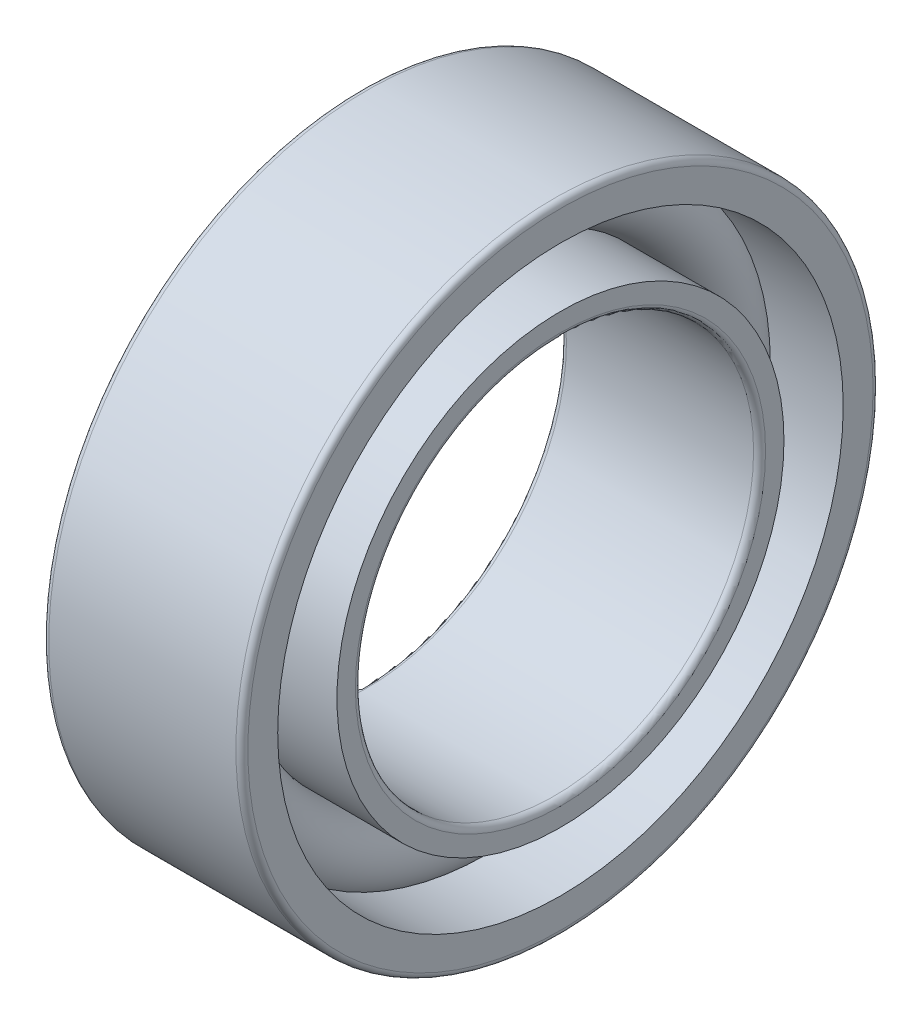
ISO-10303-21;
HEADER;
FILE_DESCRIPTION(('STEP AP214'),'2;1');
FILE_NAME('part.step','',(''),(''),'','','');
FILE_SCHEMA(('AUTOMOTIVE_DESIGN { 1 0 10303 214 1 1 1 1 }'));
ENDSEC;
DATA;
#1=APPLICATION_CONTEXT('core data for automotive mechanical design processes');
#2=APPLICATION_PROTOCOL_DEFINITION('international standard','automotive_design',2000,#1);
#3=PRODUCT_CONTEXT('',#1,'mechanical');
#4=PRODUCT('Part','Part','',(#3));
#5=PRODUCT_RELATED_PRODUCT_CATEGORY('part','',(#4));
#6=PRODUCT_DEFINITION_FORMATION('','',#4);
#7=PRODUCT_DEFINITION_CONTEXT('part definition',#1,'design');
#8=PRODUCT_DEFINITION('design','',#6,#7);
#9=PRODUCT_DEFINITION_SHAPE('','',#8);
#10=(LENGTH_UNIT() NAMED_UNIT(*) SI_UNIT(.MILLI.,.METRE.));
#11=(NAMED_UNIT(*) PLANE_ANGLE_UNIT() SI_UNIT($,.RADIAN.));
#12=(NAMED_UNIT(*) SI_UNIT($,.STERADIAN.) SOLID_ANGLE_UNIT());
#13=UNCERTAINTY_MEASURE_WITH_UNIT(LENGTH_MEASURE(1.E-05),#10,'distance_accuracy_value','');
#14=(GEOMETRIC_REPRESENTATION_CONTEXT(3) GLOBAL_UNCERTAINTY_ASSIGNED_CONTEXT((#13)) GLOBAL_UNIT_ASSIGNED_CONTEXT((#10,
#11,#12)) REPRESENTATION_CONTEXT('',''));
#15=CARTESIAN_POINT('',(0.,0.,0.));
#16=DIRECTION('',(0.,0.,1.));
#17=DIRECTION('',(1.,0.,0.));
#18=AXIS2_PLACEMENT_3D('',#15,#16,#17);
#19=CARTESIAN_POINT('',(0.,0.,0.));
#20=DIRECTION('',(-1.,0.,0.));
#21=DIRECTION('',(0.,0.,1.));
#22=AXIS2_PLACEMENT_3D('',#19,#20,#21);
#23=TOROIDAL_SURFACE('',#22,13.,1.8);
#24=CARTESIAN_POINT('',(1.34164078649988,0.,0.));
#25=DIRECTION('',(-1.,0.,0.));
#26=DIRECTION('',(0.,0.,1.));
#27=AXIS2_PLACEMENT_3D('',#24,#25,#26);
#28=CIRCLE('',#27,14.2);
#29=CARTESIAN_POINT('',(1.34164078649988,0.,14.2));
#30=VERTEX_POINT('',#29);
#31=EDGE_CURVE('E36',#30,#30,#28,.F.);
#32=ORIENTED_EDGE('',*,*,#31,.T.);
#33=EDGE_LOOP('',(#32));
#34=FACE_BOUND('',#33,.T.);
#35=CARTESIAN_POINT('',(0.29895651857753,0.,0.));
#36=DIRECTION('',(-1.,0.,0.));
#37=DIRECTION('',(0.,0.,1.));
#38=AXIS2_PLACEMENT_3D('',#35,#36,#37);
#39=CIRCLE('',#38,11.225);
#40=CARTESIAN_POINT('',(0.29895651857753,0.,11.225));
#41=VERTEX_POINT('',#40);
#42=EDGE_CURVE('E10',#41,#41,#39,.T.);
#43=ORIENTED_EDGE('',*,*,#42,.T.);
#44=EDGE_LOOP('',(#43));
#45=FACE_BOUND('',#44,.T.);
#46=ADVANCED_FACE('F32',(#34,#45),#23,.T.);
#47=CARTESIAN_POINT('',(-20.6375,0.,0.));
#48=DIRECTION('',(1.,0.,0.));
#49=DIRECTION('',(0.,0.,-1.));
#50=AXIS2_PLACEMENT_3D('',#47,#48,#49);
#51=CYLINDRICAL_SURFACE('',#50,11.225);
#52=CARTESIAN_POINT('',(5.,0.,0.));
#53=DIRECTION('',(1.,0.,0.));
#54=DIRECTION('',(0.,0.,-1.));
#55=AXIS2_PLACEMENT_3D('',#52,#53,#54);
#56=CIRCLE('',#55,11.225);
#57=CARTESIAN_POINT('',(5.,0.,-11.225));
#58=VERTEX_POINT('',#57);
#59=EDGE_CURVE('E45',#58,#58,#56,.T.);
#60=ORIENTED_EDGE('',*,*,#59,.F.);
#61=EDGE_LOOP('',(#60));
#62=FACE_BOUND('',#61,.T.);
#63=ORIENTED_EDGE('',*,*,#42,.F.);
#64=EDGE_LOOP('',(#63));
#65=FACE_BOUND('',#64,.T.);
#66=ADVANCED_FACE('F84',(#62,#65),#51,.T.);
#67=CARTESIAN_POINT('',(-20.6375,0.,0.));
#68=DIRECTION('',(1.,0.,0.));
#69=DIRECTION('',(0.,0.,-1.));
#70=AXIS2_PLACEMENT_3D('',#67,#68,#69);
#71=CYLINDRICAL_SURFACE('',#70,11.8);
#72=CARTESIAN_POINT('',(-5.,0.,0.));
#73=DIRECTION('',(1.,0.,0.));
#74=DIRECTION('',(0.,0.,-1.));
#75=AXIS2_PLACEMENT_3D('',#72,#73,#74);
#76=CIRCLE('',#75,11.8);
#77=CARTESIAN_POINT('',(-5.,0.,-11.8));
#78=VERTEX_POINT('',#77);
#79=EDGE_CURVE('E54',#78,#78,#76,.T.);
#80=ORIENTED_EDGE('',*,*,#79,.T.);
#81=EDGE_LOOP('',(#80));
#82=FACE_BOUND('',#81,.T.);
#83=CARTESIAN_POINT('',(-1.34164078649988,0.,0.));
#84=DIRECTION('',(1.,0.,0.));
#85=DIRECTION('',(0.,0.,-1.));
#86=AXIS2_PLACEMENT_3D('',#83,#84,#85);
#87=CIRCLE('',#86,11.8);
#88=CARTESIAN_POINT('',(-1.34164078649988,0.,-11.8));
#89=VERTEX_POINT('',#88);
#90=EDGE_CURVE('E40',#89,#89,#87,.T.);
#91=ORIENTED_EDGE('',*,*,#90,.F.);
#92=EDGE_LOOP('',(#91));
#93=FACE_BOUND('',#92,.T.);
#94=ADVANCED_FACE('F87',(#82,#93),#71,.T.);
#95=CARTESIAN_POINT('',(5.,10.3,0.));
#96=DIRECTION('',(1.,0.,0.));
#97=DIRECTION('',(0.,0.,-1.));
#98=AXIS2_PLACEMENT_3D('',#95,#96,#97);
#99=PLANE('',#98);
#100=ORIENTED_EDGE('',*,*,#59,.T.);
#101=EDGE_LOOP('',(#100));
#102=FACE_BOUND('',#101,.T.);
#103=CARTESIAN_POINT('',(5.,0.,0.));
#104=DIRECTION('',(1.,0.,0.));
#105=DIRECTION('',(0.,0.,-1.));
#106=AXIS2_PLACEMENT_3D('',#103,#104,#105);
#107=CIRCLE('',#106,10.3);
#108=CARTESIAN_POINT('',(5.,0.,-10.3));
#109=VERTEX_POINT('',#108);
#110=EDGE_CURVE('E76',#109,#109,#107,.T.);
#111=ORIENTED_EDGE('',*,*,#110,.F.);
#112=EDGE_LOOP('',(#111));
#113=FACE_BOUND('',#112,.T.);
#114=ADVANCED_FACE('F81',(#102,#113),#99,.T.);
#115=CARTESIAN_POINT('',(4.7,0.,0.));
#116=DIRECTION('',(1.,0.,0.));
#117=DIRECTION('',(0.,0.,-1.));
#118=AXIS2_PLACEMENT_3D('',#115,#116,#117);
#119=TOROIDAL_SURFACE('',#118,10.3,0.299999999999998);
#120=ORIENTED_EDGE('',*,*,#110,.T.);
#121=EDGE_LOOP('',(#120));
#122=FACE_BOUND('',#121,.T.);
#123=CARTESIAN_POINT('',(4.7,0.,0.));
#124=DIRECTION('',(1.,0.,0.));
#125=DIRECTION('',(0.,0.,-1.));
#126=AXIS2_PLACEMENT_3D('',#123,#124,#125);
#127=CIRCLE('',#126,10.);
#128=CARTESIAN_POINT('',(4.7,0.,-10.));
#129=VERTEX_POINT('',#128);
#130=EDGE_CURVE('E73',#129,#129,#127,.T.);
#131=ORIENTED_EDGE('',*,*,#130,.F.);
#132=EDGE_LOOP('',(#131));
#133=FACE_BOUND('',#132,.T.);
#134=ADVANCED_FACE('F98',(#122,#133),#119,.T.);
#135=CARTESIAN_POINT('',(-20.6375,0.,0.));
#136=DIRECTION('',(1.,0.,0.));
#137=DIRECTION('',(0.,0.,-1.));
#138=AXIS2_PLACEMENT_3D('',#135,#136,#137);
#139=CYLINDRICAL_SURFACE('',#138,10.);
#140=ORIENTED_EDGE('',*,*,#130,.T.);
#141=EDGE_LOOP('',(#140));
#142=FACE_BOUND('',#141,.T.);
#143=CARTESIAN_POINT('',(-4.7,0.,0.));
#144=DIRECTION('',(1.,0.,0.));
#145=DIRECTION('',(0.,0.,-1.));
#146=AXIS2_PLACEMENT_3D('',#143,#144,#145);
#147=CIRCLE('',#146,10.);
#148=CARTESIAN_POINT('',(-4.7,0.,-10.));
#149=VERTEX_POINT('',#148);
#150=EDGE_CURVE('E70',#149,#149,#147,.T.);
#151=ORIENTED_EDGE('',*,*,#150,.F.);
#152=EDGE_LOOP('',(#151));
#153=FACE_BOUND('',#152,.T.);
#154=ADVANCED_FACE('F101',(#142,#153),#139,.F.);
#155=CARTESIAN_POINT('',(-4.7,0.,0.));
#156=DIRECTION('',(1.,0.,0.));
#157=DIRECTION('',(0.,0.,-1.));
#158=AXIS2_PLACEMENT_3D('',#155,#156,#157);
#159=TOROIDAL_SURFACE('',#158,10.3,0.299999999999998);
#160=ORIENTED_EDGE('',*,*,#150,.T.);
#161=EDGE_LOOP('',(#160));
#162=FACE_BOUND('',#161,.T.);
#163=CARTESIAN_POINT('',(-5.,0.,0.));
#164=DIRECTION('',(1.,0.,0.));
#165=DIRECTION('',(0.,0.,-1.));
#166=AXIS2_PLACEMENT_3D('',#163,#164,#165);
#167=CIRCLE('',#166,10.3);
#168=CARTESIAN_POINT('',(-5.,0.,-10.3));
#169=VERTEX_POINT('',#168);
#170=EDGE_CURVE('E67',#169,#169,#167,.T.);
#171=ORIENTED_EDGE('',*,*,#170,.F.);
#172=EDGE_LOOP('',(#171));
#173=FACE_BOUND('',#172,.T.);
#174=ADVANCED_FACE('F105',(#162,#173),#159,.T.);
#175=CARTESIAN_POINT('',(-5.,11.8,0.));
#176=DIRECTION('',(-1.,0.,0.));
#177=DIRECTION('',(0.,0.,1.));
#178=AXIS2_PLACEMENT_3D('',#175,#176,#177);
#179=PLANE('',#178);
#180=ORIENTED_EDGE('',*,*,#170,.T.);
#181=EDGE_LOOP('',(#180));
#182=FACE_BOUND('',#181,.T.);
#183=ORIENTED_EDGE('',*,*,#79,.F.);
#184=EDGE_LOOP('',(#183));
#185=FACE_BOUND('',#184,.T.);
#186=ADVANCED_FACE('F109',(#182,#185),#179,.T.);
#187=CARTESIAN_POINT('',(-0.29895651857753,0.,0.));
#188=DIRECTION('',(1.,0.,0.));
#189=DIRECTION('',(0.,0.,-1.));
#190=AXIS2_PLACEMENT_3D('',#187,#188,#189);
#191=CIRCLE('',#190,14.775);
#192=CARTESIAN_POINT('',(-0.29895651857753,0.,-14.775));
#193=VERTEX_POINT('',#192);
#194=EDGE_CURVE('E48',#193,#193,#191,.F.);
#195=ORIENTED_EDGE('',*,*,#194,.T.);
#196=EDGE_LOOP('',(#195));
#197=FACE_BOUND('',#196,.T.);
#198=ORIENTED_EDGE('',*,*,#90,.T.);
#199=EDGE_LOOP('',(#198));
#200=FACE_BOUND('',#199,.T.);
#201=ADVANCED_FACE('F34',(#197,#200),#23,.T.);
#202=CARTESIAN_POINT('',(-20.6375,0.,0.));
#203=DIRECTION('',(1.,0.,0.));
#204=DIRECTION('',(0.,0.,-1.));
#205=AXIS2_PLACEMENT_3D('',#202,#203,#204);
#206=CYLINDRICAL_SURFACE('',#205,14.2);
#207=CARTESIAN_POINT('',(5.,0.,0.));
#208=DIRECTION('',(1.,0.,0.));
#209=DIRECTION('',(0.,0.,-1.));
#210=AXIS2_PLACEMENT_3D('',#207,#208,#209);
#211=CIRCLE('',#210,14.2);
#212=CARTESIAN_POINT('',(5.,0.,-14.2));
#213=VERTEX_POINT('',#212);
#214=EDGE_CURVE('E150',#213,#213,#211,.T.);
#215=ORIENTED_EDGE('',*,*,#214,.T.);
#216=EDGE_LOOP('',(#215));
#217=FACE_BOUND('',#216,.T.);
#218=ORIENTED_EDGE('',*,*,#31,.F.);
#219=EDGE_LOOP('',(#218));
#220=FACE_BOUND('',#219,.T.);
#221=ADVANCED_FACE('F131',(#217,#220),#206,.F.);
#222=CARTESIAN_POINT('',(-20.6375,0.,0.));
#223=DIRECTION('',(1.,0.,0.));
#224=DIRECTION('',(0.,0.,-1.));
#225=AXIS2_PLACEMENT_3D('',#222,#223,#224);
#226=CYLINDRICAL_SURFACE('',#225,14.775);
#227=CARTESIAN_POINT('',(-5.,0.,0.));
#228=DIRECTION('',(1.,0.,0.));
#229=DIRECTION('',(0.,0.,-1.));
#230=AXIS2_PLACEMENT_3D('',#227,#228,#229);
#231=CIRCLE('',#230,14.775);
#232=CARTESIAN_POINT('',(-5.,0.,-14.775));
#233=VERTEX_POINT('',#232);
#234=EDGE_CURVE('E145',#233,#233,#231,.T.);
#235=ORIENTED_EDGE('',*,*,#234,.F.);
#236=EDGE_LOOP('',(#235));
#237=FACE_BOUND('',#236,.T.);
#238=ORIENTED_EDGE('',*,*,#194,.F.);
#239=EDGE_LOOP('',(#238));
#240=FACE_BOUND('',#239,.T.);
#241=ADVANCED_FACE('F118',(#237,#240),#226,.F.);
#242=CARTESIAN_POINT('',(-4.7,0.,0.));
#243=DIRECTION('',(1.,0.,0.));
#244=DIRECTION('',(0.,0.,-1.));
#245=AXIS2_PLACEMENT_3D('',#242,#243,#244);
#246=TOROIDAL_SURFACE('',#245,15.7,0.300000000000001);
#247=CARTESIAN_POINT('',(-5.,0.,0.));
#248=DIRECTION('',(1.,0.,0.));
#249=DIRECTION('',(0.,0.,-1.));
#250=AXIS2_PLACEMENT_3D('',#247,#248,#249);
#251=CIRCLE('',#250,15.7);
#252=CARTESIAN_POINT('',(-5.,0.,-15.7));
#253=VERTEX_POINT('',#252);
#254=EDGE_CURVE('E148',#253,#253,#251,.T.);
#255=ORIENTED_EDGE('',*,*,#254,.T.);
#256=EDGE_LOOP('',(#255));
#257=FACE_BOUND('',#256,.T.);
#258=CARTESIAN_POINT('',(-4.7,0.,0.));
#259=DIRECTION('',(1.,0.,0.));
#260=DIRECTION('',(0.,0.,-1.));
#261=AXIS2_PLACEMENT_3D('',#258,#259,#260);
#262=CIRCLE('',#261,16.);
#263=CARTESIAN_POINT('',(-4.7,0.,-16.));
#264=VERTEX_POINT('',#263);
#265=EDGE_CURVE('E50',#264,#264,#262,.T.);
#266=ORIENTED_EDGE('',*,*,#265,.F.);
#267=EDGE_LOOP('',(#266));
#268=FACE_BOUND('',#267,.T.);
#269=ADVANCED_FACE('F114',(#257,#268),#246,.T.);
#270=CARTESIAN_POINT('',(-20.6375,0.,0.));
#271=DIRECTION('',(1.,0.,0.));
#272=DIRECTION('',(0.,0.,-1.));
#273=AXIS2_PLACEMENT_3D('',#270,#271,#272);
#274=CYLINDRICAL_SURFACE('',#273,16.);
#275=ORIENTED_EDGE('',*,*,#265,.T.);
#276=EDGE_LOOP('',(#275));
#277=FACE_BOUND('',#276,.T.);
#278=CARTESIAN_POINT('',(4.7,0.,0.));
#279=DIRECTION('',(1.,0.,0.));
#280=DIRECTION('',(0.,0.,-1.));
#281=AXIS2_PLACEMENT_3D('',#278,#279,#280);
#282=CIRCLE('',#281,16.);
#283=CARTESIAN_POINT('',(4.7,0.,-16.));
#284=VERTEX_POINT('',#283);
#285=EDGE_CURVE('E56',#284,#284,#282,.T.);
#286=ORIENTED_EDGE('',*,*,#285,.F.);
#287=EDGE_LOOP('',(#286));
#288=FACE_BOUND('',#287,.T.);
#289=ADVANCED_FACE('F117',(#277,#288),#274,.T.);
#290=CARTESIAN_POINT('',(4.7,0.,0.));
#291=DIRECTION('',(1.,0.,0.));
#292=DIRECTION('',(0.,0.,-1.));
#293=AXIS2_PLACEMENT_3D('',#290,#291,#292);
#294=TOROIDAL_SURFACE('',#293,15.7,0.300000000000001);
#295=ORIENTED_EDGE('',*,*,#285,.T.);
#296=EDGE_LOOP('',(#295));
#297=FACE_BOUND('',#296,.T.);
#298=CARTESIAN_POINT('',(5.,0.,0.));
#299=DIRECTION('',(1.,0.,0.));
#300=DIRECTION('',(0.,0.,-1.));
#301=AXIS2_PLACEMENT_3D('',#298,#299,#300);
#302=CIRCLE('',#301,15.7);
#303=CARTESIAN_POINT('',(5.,0.,-15.7));
#304=VERTEX_POINT('',#303);
#305=EDGE_CURVE('E61',#304,#304,#302,.T.);
#306=ORIENTED_EDGE('',*,*,#305,.F.);
#307=EDGE_LOOP('',(#306));
#308=FACE_BOUND('',#307,.T.);
#309=ADVANCED_FACE('F122',(#297,#308),#294,.T.);
#310=CARTESIAN_POINT('',(5.,15.7,0.));
#311=DIRECTION('',(1.,0.,0.));
#312=DIRECTION('',(0.,0.,-1.));
#313=AXIS2_PLACEMENT_3D('',#310,#311,#312);
#314=PLANE('',#313);
#315=ORIENTED_EDGE('',*,*,#305,.T.);
#316=EDGE_LOOP('',(#315));
#317=FACE_BOUND('',#316,.T.);
#318=ORIENTED_EDGE('',*,*,#214,.F.);
#319=EDGE_LOOP('',(#318));
#320=FACE_BOUND('',#319,.T.);
#321=ADVANCED_FACE('F125',(#317,#320),#314,.T.);
#322=CARTESIAN_POINT('',(-5.,14.775,0.));
#323=DIRECTION('',(-1.,0.,0.));
#324=DIRECTION('',(0.,0.,1.));
#325=AXIS2_PLACEMENT_3D('',#322,#323,#324);
#326=PLANE('',#325);
#327=ORIENTED_EDGE('',*,*,#234,.T.);
#328=EDGE_LOOP('',(#327));
#329=FACE_BOUND('',#328,.T.);
#330=ORIENTED_EDGE('',*,*,#254,.F.);
#331=EDGE_LOOP('',(#330));
#332=FACE_BOUND('',#331,.T.);
#333=ADVANCED_FACE('F129',(#329,#332),#326,.T.);
#334=CLOSED_SHELL('',(#46,#66,#94,#114,#134,#154,#174,#186,#201,#221,#241,#269,#289,#309,#321,#333));
#335=MANIFOLD_SOLID_BREP('B2',#334);
#336=ADVANCED_BREP_SHAPE_REPRESENTATION('',(#18,#335),#14);
#337=SHAPE_DEFINITION_REPRESENTATION(#9,#336);
ENDSEC;
END-ISO-10303-21;
